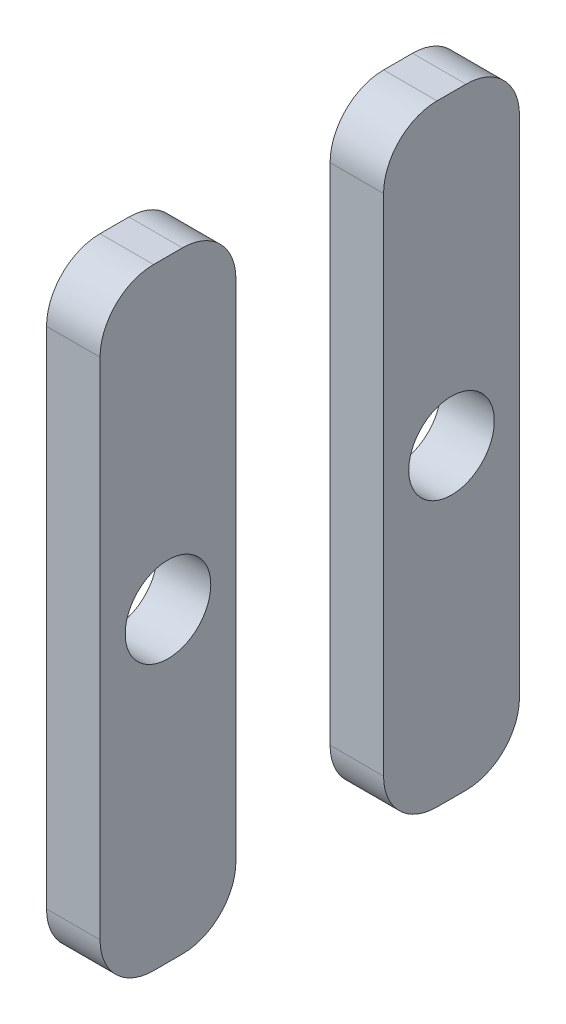
ISO-10303-21;
HEADER;
FILE_DESCRIPTION(('STEP AP214'),'2;1');
FILE_NAME('part.step','',(''),(''),'','','');
FILE_SCHEMA(('AUTOMOTIVE_DESIGN { 1 0 10303 214 1 1 1 1 }'));
ENDSEC;
DATA;
#1=APPLICATION_CONTEXT('core data for automotive mechanical design processes');
#2=APPLICATION_PROTOCOL_DEFINITION('international standard','automotive_design',2000,#1);
#3=PRODUCT_CONTEXT('',#1,'mechanical');
#4=PRODUCT('Part','Part','',(#3));
#5=PRODUCT_RELATED_PRODUCT_CATEGORY('part','',(#4));
#6=PRODUCT_DEFINITION_FORMATION('','',#4);
#7=PRODUCT_DEFINITION_CONTEXT('part definition',#1,'design');
#8=PRODUCT_DEFINITION('design','',#6,#7);
#9=PRODUCT_DEFINITION_SHAPE('','',#8);
#10=(LENGTH_UNIT() NAMED_UNIT(*) SI_UNIT(.MILLI.,.METRE.));
#11=(NAMED_UNIT(*) PLANE_ANGLE_UNIT() SI_UNIT($,.RADIAN.));
#12=(NAMED_UNIT(*) SI_UNIT($,.STERADIAN.) SOLID_ANGLE_UNIT());
#13=UNCERTAINTY_MEASURE_WITH_UNIT(LENGTH_MEASURE(1.E-05),#10,'distance_accuracy_value','');
#14=(GEOMETRIC_REPRESENTATION_CONTEXT(3) GLOBAL_UNCERTAINTY_ASSIGNED_CONTEXT((#13)) GLOBAL_UNIT_ASSIGNED_CONTEXT((#10,
#11,#12)) REPRESENTATION_CONTEXT('',''));
#15=CARTESIAN_POINT('',(0.,0.,0.));
#16=DIRECTION('',(0.,0.,1.));
#17=DIRECTION('',(1.,0.,0.));
#18=AXIS2_PLACEMENT_3D('',#15,#16,#17);
#19=CARTESIAN_POINT('',(10.,0.,0.));
#20=DIRECTION('',(-1.,0.,0.));
#21=DIRECTION('',(0.,0.,1.));
#22=AXIS2_PLACEMENT_3D('',#19,#20,#21);
#23=PLANE('',#22);
#24=DIRECTION('',(0.,-1.,0.));
#25=VECTOR('',#24,1.);
#26=CARTESIAN_POINT('',(10.,57.155,-13.8));
#27=LINE('',#26,#25);
#28=CARTESIAN_POINT('',(10.,47.155,-13.8));
#29=VERTEX_POINT('',#28);
#30=CARTESIAN_POINT('',(10.,-47.155,-13.8));
#31=VERTEX_POINT('',#30);
#32=EDGE_CURVE('E155',#29,#31,#27,.T.);
#33=ORIENTED_EDGE('',*,*,#32,.T.);
#34=CARTESIAN_POINT('',(10.,-47.155,-23.8));
#35=DIRECTION('',(-1.,0.,0.));
#36=DIRECTION('',(0.,0.,1.));
#37=AXIS2_PLACEMENT_3D('',#34,#35,#36);
#38=CIRCLE('',#37,10.);
#39=CARTESIAN_POINT('',(10.,-57.155,-23.8));
#40=VERTEX_POINT('',#39);
#41=EDGE_CURVE('E177',#31,#40,#38,.F.);
#42=ORIENTED_EDGE('',*,*,#41,.T.);
#43=DIRECTION('',(0.,0.,-1.));
#44=VECTOR('',#43,1.);
#45=CARTESIAN_POINT('',(10.,-57.155,-39.2));
#46=LINE('',#45,#44);
#47=CARTESIAN_POINT('',(10.,-57.155,-29.2));
#48=VERTEX_POINT('',#47);
#49=EDGE_CURVE('E134',#40,#48,#46,.T.);
#50=ORIENTED_EDGE('',*,*,#49,.T.);
#51=CARTESIAN_POINT('',(10.,-47.155,-29.2));
#52=DIRECTION('',(-1.,0.,0.));
#53=DIRECTION('',(0.,0.,1.));
#54=AXIS2_PLACEMENT_3D('',#51,#52,#53);
#55=CIRCLE('',#54,10.);
#56=CARTESIAN_POINT('',(10.,-47.155,-39.2));
#57=VERTEX_POINT('',#56);
#58=EDGE_CURVE('E175',#48,#57,#55,.F.);
#59=ORIENTED_EDGE('',*,*,#58,.T.);
#60=DIRECTION('',(0.,1.,0.));
#61=VECTOR('',#60,1.);
#62=CARTESIAN_POINT('',(10.,57.155,-39.2));
#63=LINE('',#62,#61);
#64=CARTESIAN_POINT('',(10.,47.155,-39.2));
#65=VERTEX_POINT('',#64);
#66=EDGE_CURVE('E142',#57,#65,#63,.T.);
#67=ORIENTED_EDGE('',*,*,#66,.T.);
#68=CARTESIAN_POINT('',(10.,47.155,-29.2));
#69=DIRECTION('',(-1.,0.,0.));
#70=DIRECTION('',(0.,0.,1.));
#71=AXIS2_PLACEMENT_3D('',#68,#69,#70);
#72=CIRCLE('',#71,10.);
#73=CARTESIAN_POINT('',(10.,57.155,-29.2));
#74=VERTEX_POINT('',#73);
#75=EDGE_CURVE('E69',#65,#74,#72,.F.);
#76=ORIENTED_EDGE('',*,*,#75,.T.);
#77=DIRECTION('',(0.,0.,1.));
#78=VECTOR('',#77,1.);
#79=CARTESIAN_POINT('',(10.,57.155,-39.2));
#80=LINE('',#79,#78);
#81=CARTESIAN_POINT('',(10.,57.155,-23.8));
#82=VERTEX_POINT('',#81);
#83=EDGE_CURVE('E146',#74,#82,#80,.T.);
#84=ORIENTED_EDGE('',*,*,#83,.T.);
#85=CARTESIAN_POINT('',(10.,47.155,-23.8));
#86=DIRECTION('',(-1.,0.,0.));
#87=DIRECTION('',(0.,0.,1.));
#88=AXIS2_PLACEMENT_3D('',#85,#86,#87);
#89=CIRCLE('',#88,10.);
#90=EDGE_CURVE('E173',#82,#29,#89,.F.);
#91=ORIENTED_EDGE('',*,*,#90,.T.);
#92=EDGE_LOOP('',(#33,#42,#50,#59,#67,#76,#84,#91));
#93=FACE_BOUND('',#92,.T.);
#94=CARTESIAN_POINT('',(10.,0.,-26.5));
#95=DIRECTION('',(1.,0.,0.));
#96=DIRECTION('',(0.,0.,1.));
#97=AXIS2_PLACEMENT_3D('',#94,#95,#96);
#98=CIRCLE('',#97,8.);
#99=CARTESIAN_POINT('',(10.,0.,-18.5));
#100=VERTEX_POINT('',#99);
#101=EDGE_CURVE('E153',#100,#100,#98,.T.);
#102=ORIENTED_EDGE('',*,*,#101,.F.);
#103=EDGE_LOOP('',(#102));
#104=FACE_BOUND('',#103,.T.);
#105=ADVANCED_FACE('F49',(#93,#104),#23,.F.);
#106=CARTESIAN_POINT('',(0.,0.,0.));
#107=DIRECTION('',(-1.,0.,0.));
#108=DIRECTION('',(0.,0.,1.));
#109=AXIS2_PLACEMENT_3D('',#106,#107,#108);
#110=PLANE('',#109);
#111=DIRECTION('',(0.,0.,-1.));
#112=VECTOR('',#111,1.);
#113=CARTESIAN_POINT('',(0.,-57.155,-39.2));
#114=LINE('',#113,#112);
#115=CARTESIAN_POINT('',(0.,-57.155,-23.8));
#116=VERTEX_POINT('',#115);
#117=CARTESIAN_POINT('',(0.,-57.155,-29.2));
#118=VERTEX_POINT('',#117);
#119=EDGE_CURVE('E131',#116,#118,#114,.T.);
#120=ORIENTED_EDGE('',*,*,#119,.F.);
#121=CARTESIAN_POINT('',(0.,-47.155,-23.8));
#122=DIRECTION('',(-1.,0.,0.));
#123=DIRECTION('',(0.,0.,1.));
#124=AXIS2_PLACEMENT_3D('',#121,#122,#123);
#125=CIRCLE('',#124,10.);
#126=CARTESIAN_POINT('',(0.,-47.155,-13.8));
#127=VERTEX_POINT('',#126);
#128=EDGE_CURVE('E114',#116,#127,#125,.T.);
#129=ORIENTED_EDGE('',*,*,#128,.T.);
#130=DIRECTION('',(0.,-1.,0.));
#131=VECTOR('',#130,1.);
#132=CARTESIAN_POINT('',(0.,57.155,-13.8));
#133=LINE('',#132,#131);
#134=CARTESIAN_POINT('',(0.,47.155,-13.8));
#135=VERTEX_POINT('',#134);
#136=EDGE_CURVE('E141',#135,#127,#133,.T.);
#137=ORIENTED_EDGE('',*,*,#136,.F.);
#138=CARTESIAN_POINT('',(0.,47.155,-23.8));
#139=DIRECTION('',(-1.,0.,0.));
#140=DIRECTION('',(0.,0.,1.));
#141=AXIS2_PLACEMENT_3D('',#138,#139,#140);
#142=CIRCLE('',#141,10.);
#143=CARTESIAN_POINT('',(0.,57.155,-23.8));
#144=VERTEX_POINT('',#143);
#145=EDGE_CURVE('E166',#135,#144,#142,.T.);
#146=ORIENTED_EDGE('',*,*,#145,.T.);
#147=DIRECTION('',(0.,0.,1.));
#148=VECTOR('',#147,1.);
#149=CARTESIAN_POINT('',(0.,57.155,-39.2));
#150=LINE('',#149,#148);
#151=CARTESIAN_POINT('',(0.,57.155,-29.2));
#152=VERTEX_POINT('',#151);
#153=EDGE_CURVE('E144',#152,#144,#150,.T.);
#154=ORIENTED_EDGE('',*,*,#153,.F.);
#155=CARTESIAN_POINT('',(0.,47.155,-29.2));
#156=DIRECTION('',(-1.,0.,0.));
#157=DIRECTION('',(0.,0.,1.));
#158=AXIS2_PLACEMENT_3D('',#155,#156,#157);
#159=CIRCLE('',#158,10.);
#160=CARTESIAN_POINT('',(0.,47.155,-39.2));
#161=VERTEX_POINT('',#160);
#162=EDGE_CURVE('E135',#152,#161,#159,.T.);
#163=ORIENTED_EDGE('',*,*,#162,.T.);
#164=DIRECTION('',(0.,1.,0.));
#165=VECTOR('',#164,1.);
#166=CARTESIAN_POINT('',(0.,57.155,-39.2));
#167=LINE('',#166,#165);
#168=CARTESIAN_POINT('',(0.,-47.155,-39.2));
#169=VERTEX_POINT('',#168);
#170=EDGE_CURVE('E150',#169,#161,#167,.T.);
#171=ORIENTED_EDGE('',*,*,#170,.F.);
#172=CARTESIAN_POINT('',(0.,-47.155,-29.2));
#173=DIRECTION('',(-1.,0.,0.));
#174=DIRECTION('',(0.,0.,1.));
#175=AXIS2_PLACEMENT_3D('',#172,#173,#174);
#176=CIRCLE('',#175,10.);
#177=EDGE_CURVE('E125',#169,#118,#176,.T.);
#178=ORIENTED_EDGE('',*,*,#177,.T.);
#179=EDGE_LOOP('',(#120,#129,#137,#146,#154,#163,#171,#178));
#180=FACE_BOUND('',#179,.T.);
#181=CARTESIAN_POINT('',(0.,0.,-26.5));
#182=DIRECTION('',(1.,0.,0.));
#183=DIRECTION('',(0.,0.,1.));
#184=AXIS2_PLACEMENT_3D('',#181,#182,#183);
#185=CIRCLE('',#184,8.);
#186=CARTESIAN_POINT('',(0.,0.,-18.5));
#187=VERTEX_POINT('',#186);
#188=EDGE_CURVE('E159',#187,#187,#185,.T.);
#189=ORIENTED_EDGE('',*,*,#188,.T.);
#190=EDGE_LOOP('',(#189));
#191=FACE_BOUND('',#190,.T.);
#192=ADVANCED_FACE('F138',(#180,#191),#110,.T.);
#193=CARTESIAN_POINT('',(10.,57.155,-39.2));
#194=DIRECTION('',(0.,0.,1.));
#195=DIRECTION('',(1.,0.,0.));
#196=AXIS2_PLACEMENT_3D('',#193,#194,#195);
#197=PLANE('',#196);
#198=ORIENTED_EDGE('',*,*,#66,.F.);
#199=DIRECTION('',(-1.,0.,0.));
#200=VECTOR('',#199,1.);
#201=CARTESIAN_POINT('',(10.,-47.155,-39.2));
#202=LINE('',#201,#200);
#203=EDGE_CURVE('E181',#57,#169,#202,.T.);
#204=ORIENTED_EDGE('',*,*,#203,.T.);
#205=ORIENTED_EDGE('',*,*,#170,.T.);
#206=DIRECTION('',(-1.,0.,0.));
#207=VECTOR('',#206,1.);
#208=CARTESIAN_POINT('',(10.,47.155,-39.2));
#209=LINE('',#208,#207);
#210=EDGE_CURVE('E179',#161,#65,#209,.F.);
#211=ORIENTED_EDGE('',*,*,#210,.T.);
#212=EDGE_LOOP('',(#198,#204,#205,#211));
#213=FACE_BOUND('',#212,.T.);
#214=ADVANCED_FACE('F202',(#213),#197,.F.);
#215=CARTESIAN_POINT('',(10.,57.155,-39.2));
#216=DIRECTION('',(0.,-1.,0.));
#217=DIRECTION('',(0.,0.,-1.));
#218=AXIS2_PLACEMENT_3D('',#215,#216,#217);
#219=PLANE('',#218);
#220=ORIENTED_EDGE('',*,*,#153,.T.);
#221=DIRECTION('',(-1.,0.,0.));
#222=VECTOR('',#221,1.);
#223=CARTESIAN_POINT('',(10.,57.155,-23.8));
#224=LINE('',#223,#222);
#225=EDGE_CURVE('E12',#144,#82,#224,.F.);
#226=ORIENTED_EDGE('',*,*,#225,.T.);
#227=ORIENTED_EDGE('',*,*,#83,.F.);
#228=DIRECTION('',(-1.,0.,0.));
#229=VECTOR('',#228,1.);
#230=CARTESIAN_POINT('',(10.,57.155,-29.2));
#231=LINE('',#230,#229);
#232=EDGE_CURVE('E57',#74,#152,#231,.T.);
#233=ORIENTED_EDGE('',*,*,#232,.T.);
#234=EDGE_LOOP('',(#220,#226,#227,#233));
#235=FACE_BOUND('',#234,.T.);
#236=ADVANCED_FACE('F186',(#235),#219,.F.);
#237=CARTESIAN_POINT('',(10.,57.155,-13.8));
#238=DIRECTION('',(0.,0.,-1.));
#239=DIRECTION('',(0.,1.,0.));
#240=AXIS2_PLACEMENT_3D('',#237,#238,#239);
#241=PLANE('',#240);
#242=ORIENTED_EDGE('',*,*,#136,.T.);
#243=DIRECTION('',(-1.,0.,0.));
#244=VECTOR('',#243,1.);
#245=CARTESIAN_POINT('',(10.,-47.155,-13.8));
#246=LINE('',#245,#244);
#247=EDGE_CURVE('E119',#127,#31,#246,.F.);
#248=ORIENTED_EDGE('',*,*,#247,.T.);
#249=ORIENTED_EDGE('',*,*,#32,.F.);
#250=DIRECTION('',(-1.,0.,0.));
#251=VECTOR('',#250,1.);
#252=CARTESIAN_POINT('',(10.,47.155,-13.8));
#253=LINE('',#252,#251);
#254=EDGE_CURVE('E124',#29,#135,#253,.T.);
#255=ORIENTED_EDGE('',*,*,#254,.T.);
#256=EDGE_LOOP('',(#242,#248,#249,#255));
#257=FACE_BOUND('',#256,.T.);
#258=ADVANCED_FACE('F194',(#257),#241,.F.);
#259=CARTESIAN_POINT('',(10.,-57.155,-39.2));
#260=DIRECTION('',(0.,1.,0.));
#261=DIRECTION('',(0.,0.,1.));
#262=AXIS2_PLACEMENT_3D('',#259,#260,#261);
#263=PLANE('',#262);
#264=ORIENTED_EDGE('',*,*,#49,.F.);
#265=DIRECTION('',(-1.,0.,0.));
#266=VECTOR('',#265,1.);
#267=CARTESIAN_POINT('',(10.,-57.155,-23.8));
#268=LINE('',#267,#266);
#269=EDGE_CURVE('E118',#40,#116,#268,.T.);
#270=ORIENTED_EDGE('',*,*,#269,.T.);
#271=ORIENTED_EDGE('',*,*,#119,.T.);
#272=DIRECTION('',(-1.,0.,0.));
#273=VECTOR('',#272,1.);
#274=CARTESIAN_POINT('',(10.,-57.155,-29.2));
#275=LINE('',#274,#273);
#276=EDGE_CURVE('E136',#118,#48,#275,.F.);
#277=ORIENTED_EDGE('',*,*,#276,.T.);
#278=EDGE_LOOP('',(#264,#270,#271,#277));
#279=FACE_BOUND('',#278,.T.);
#280=ADVANCED_FACE('F130',(#279),#263,.F.);
#281=CARTESIAN_POINT('',(10.,0.,-26.5));
#282=DIRECTION('',(-1.,0.,0.));
#283=DIRECTION('',(0.,0.,1.));
#284=AXIS2_PLACEMENT_3D('',#281,#282,#283);
#285=CYLINDRICAL_SURFACE('',#284,8.);
#286=ORIENTED_EDGE('',*,*,#101,.T.);
#287=EDGE_LOOP('',(#286));
#288=FACE_BOUND('',#287,.T.);
#289=ORIENTED_EDGE('',*,*,#188,.F.);
#290=EDGE_LOOP('',(#289));
#291=FACE_BOUND('',#290,.T.);
#292=ADVANCED_FACE('F217',(#288,#291),#285,.F.);
#293=CARTESIAN_POINT('',(10.,-47.155,-23.8));
#294=DIRECTION('',(-1.,0.,0.));
#295=DIRECTION('',(0.,0.,1.));
#296=AXIS2_PLACEMENT_3D('',#293,#294,#295);
#297=CYLINDRICAL_SURFACE('',#296,10.);
#298=ORIENTED_EDGE('',*,*,#41,.F.);
#299=ORIENTED_EDGE('',*,*,#247,.F.);
#300=ORIENTED_EDGE('',*,*,#128,.F.);
#301=ORIENTED_EDGE('',*,*,#269,.F.);
#302=EDGE_LOOP('',(#298,#299,#300,#301));
#303=FACE_BOUND('',#302,.T.);
#304=ADVANCED_FACE('F117',(#303),#297,.T.);
#305=CARTESIAN_POINT('',(10.,-47.155,-29.2));
#306=DIRECTION('',(-1.,0.,0.));
#307=DIRECTION('',(0.,0.,1.));
#308=AXIS2_PLACEMENT_3D('',#305,#306,#307);
#309=CYLINDRICAL_SURFACE('',#308,10.);
#310=ORIENTED_EDGE('',*,*,#58,.F.);
#311=ORIENTED_EDGE('',*,*,#276,.F.);
#312=ORIENTED_EDGE('',*,*,#177,.F.);
#313=ORIENTED_EDGE('',*,*,#203,.F.);
#314=EDGE_LOOP('',(#310,#311,#312,#313));
#315=FACE_BOUND('',#314,.T.);
#316=ADVANCED_FACE('F200',(#315),#309,.T.);
#317=CARTESIAN_POINT('',(10.,47.155,-23.8));
#318=DIRECTION('',(-1.,0.,0.));
#319=DIRECTION('',(0.,0.,1.));
#320=AXIS2_PLACEMENT_3D('',#317,#318,#319);
#321=CYLINDRICAL_SURFACE('',#320,10.);
#322=ORIENTED_EDGE('',*,*,#90,.F.);
#323=ORIENTED_EDGE('',*,*,#225,.F.);
#324=ORIENTED_EDGE('',*,*,#145,.F.);
#325=ORIENTED_EDGE('',*,*,#254,.F.);
#326=EDGE_LOOP('',(#322,#323,#324,#325));
#327=FACE_BOUND('',#326,.T.);
#328=ADVANCED_FACE('F191',(#327),#321,.T.);
#329=CARTESIAN_POINT('',(10.,47.155,-29.2));
#330=DIRECTION('',(-1.,0.,0.));
#331=DIRECTION('',(0.,0.,1.));
#332=AXIS2_PLACEMENT_3D('',#329,#330,#331);
#333=CYLINDRICAL_SURFACE('',#332,10.);
#334=ORIENTED_EDGE('',*,*,#75,.F.);
#335=ORIENTED_EDGE('',*,*,#210,.F.);
#336=ORIENTED_EDGE('',*,*,#162,.F.);
#337=ORIENTED_EDGE('',*,*,#232,.F.);
#338=EDGE_LOOP('',(#334,#335,#336,#337));
#339=FACE_BOUND('',#338,.T.);
#340=ADVANCED_FACE('F51',(#339),#333,.T.);
#341=CLOSED_SHELL('',(#105,#192,#214,#236,#258,#280,#292,#304,#316,#328,#340));
#342=MANIFOLD_SOLID_BREP('B2',#341);
#343=CARTESIAN_POINT('',(10.,0.,0.));
#344=DIRECTION('',(1.,0.,0.));
#345=DIRECTION('',(0.,0.,-1.));
#346=AXIS2_PLACEMENT_3D('',#343,#344,#345);
#347=PLANE('',#346);
#348=DIRECTION('',(0.,0.,-1.));
#349=VECTOR('',#348,1.);
#350=CARTESIAN_POINT('',(10.,-57.155,39.2));
#351=LINE('',#350,#349);
#352=CARTESIAN_POINT('',(10.,-57.155,29.2));
#353=VERTEX_POINT('',#352);
#354=CARTESIAN_POINT('',(10.,-57.155,23.8));
#355=VERTEX_POINT('',#354);
#356=EDGE_CURVE('E402',#353,#355,#351,.T.);
#357=ORIENTED_EDGE('',*,*,#356,.T.);
#358=CARTESIAN_POINT('',(10.,-47.155,23.8));
#359=DIRECTION('',(1.,0.,0.));
#360=DIRECTION('',(0.,0.,-1.));
#361=AXIS2_PLACEMENT_3D('',#358,#359,#360);
#362=CIRCLE('',#361,10.);
#363=CARTESIAN_POINT('',(10.,-47.155,13.8));
#364=VERTEX_POINT('',#363);
#365=EDGE_CURVE('E420',#355,#364,#362,.T.);
#366=ORIENTED_EDGE('',*,*,#365,.T.);
#367=DIRECTION('',(0.,1.,0.));
#368=VECTOR('',#367,1.);
#369=CARTESIAN_POINT('',(10.,57.155,13.8));
#370=LINE('',#369,#368);
#371=CARTESIAN_POINT('',(10.,47.155,13.8));
#372=VERTEX_POINT('',#371);
#373=EDGE_CURVE('E384',#364,#372,#370,.T.);
#374=ORIENTED_EDGE('',*,*,#373,.T.);
#375=CARTESIAN_POINT('',(10.,47.155,23.8));
#376=DIRECTION('',(1.,0.,0.));
#377=DIRECTION('',(0.,0.,-1.));
#378=AXIS2_PLACEMENT_3D('',#375,#376,#377);
#379=CIRCLE('',#378,10.);
#380=CARTESIAN_POINT('',(10.,57.155,23.8));
#381=VERTEX_POINT('',#380);
#382=EDGE_CURVE('E416',#372,#381,#379,.T.);
#383=ORIENTED_EDGE('',*,*,#382,.T.);
#384=DIRECTION('',(0.,0.,1.));
#385=VECTOR('',#384,1.);
#386=CARTESIAN_POINT('',(10.,57.155,39.2));
#387=LINE('',#386,#385);
#388=CARTESIAN_POINT('',(10.,57.155,29.2));
#389=VERTEX_POINT('',#388);
#390=EDGE_CURVE('E429',#381,#389,#387,.T.);
#391=ORIENTED_EDGE('',*,*,#390,.T.);
#392=CARTESIAN_POINT('',(10.,47.155,29.2));
#393=DIRECTION('',(1.,0.,0.));
#394=DIRECTION('',(0.,0.,-1.));
#395=AXIS2_PLACEMENT_3D('',#392,#393,#394);
#396=CIRCLE('',#395,10.);
#397=CARTESIAN_POINT('',(10.,47.155,39.2));
#398=VERTEX_POINT('',#397);
#399=EDGE_CURVE('E319',#389,#398,#396,.T.);
#400=ORIENTED_EDGE('',*,*,#399,.T.);
#401=DIRECTION('',(0.,-1.,0.));
#402=VECTOR('',#401,1.);
#403=CARTESIAN_POINT('',(10.,57.155,39.2));
#404=LINE('',#403,#402);
#405=CARTESIAN_POINT('',(10.,-47.155,39.2));
#406=VERTEX_POINT('',#405);
#407=EDGE_CURVE('E435',#398,#406,#404,.T.);
#408=ORIENTED_EDGE('',*,*,#407,.T.);
#409=CARTESIAN_POINT('',(10.,-47.155,29.2));
#410=DIRECTION('',(1.,0.,0.));
#411=DIRECTION('',(0.,0.,-1.));
#412=AXIS2_PLACEMENT_3D('',#409,#410,#411);
#413=CIRCLE('',#412,10.);
#414=EDGE_CURVE('E418',#406,#353,#413,.T.);
#415=ORIENTED_EDGE('',*,*,#414,.T.);
#416=EDGE_LOOP('',(#357,#366,#374,#383,#391,#400,#408,#415));
#417=FACE_BOUND('',#416,.T.);
#418=CARTESIAN_POINT('',(10.,0.,26.5));
#419=DIRECTION('',(1.,0.,0.));
#420=DIRECTION('',(0.,0.,-1.));
#421=AXIS2_PLACEMENT_3D('',#418,#419,#420);
#422=CIRCLE('',#421,8.);
#423=CARTESIAN_POINT('',(10.,0.,18.5));
#424=VERTEX_POINT('',#423);
#425=EDGE_CURVE('E393',#424,#424,#422,.T.);
#426=ORIENTED_EDGE('',*,*,#425,.F.);
#427=EDGE_LOOP('',(#426));
#428=FACE_BOUND('',#427,.T.);
#429=ADVANCED_FACE('F297',(#417,#428),#347,.T.);
#430=CARTESIAN_POINT('',(0.,0.,0.));
#431=DIRECTION('',(1.,0.,0.));
#432=DIRECTION('',(0.,0.,-1.));
#433=AXIS2_PLACEMENT_3D('',#430,#431,#432);
#434=PLANE('',#433);
#435=DIRECTION('',(0.,1.,0.));
#436=VECTOR('',#435,1.);
#437=CARTESIAN_POINT('',(0.,57.155,13.8));
#438=LINE('',#437,#436);
#439=CARTESIAN_POINT('',(0.,-47.155,13.8));
#440=VERTEX_POINT('',#439);
#441=CARTESIAN_POINT('',(0.,47.155,13.8));
#442=VERTEX_POINT('',#441);
#443=EDGE_CURVE('E381',#440,#442,#438,.T.);
#444=ORIENTED_EDGE('',*,*,#443,.F.);
#445=CARTESIAN_POINT('',(0.,-47.155,23.8));
#446=DIRECTION('',(1.,0.,0.));
#447=DIRECTION('',(0.,0.,-1.));
#448=AXIS2_PLACEMENT_3D('',#445,#446,#447);
#449=CIRCLE('',#448,10.);
#450=CARTESIAN_POINT('',(0.,-57.155,23.8));
#451=VERTEX_POINT('',#450);
#452=EDGE_CURVE('E364',#440,#451,#449,.F.);
#453=ORIENTED_EDGE('',*,*,#452,.T.);
#454=DIRECTION('',(0.,0.,-1.));
#455=VECTOR('',#454,1.);
#456=CARTESIAN_POINT('',(0.,-57.155,39.2));
#457=LINE('',#456,#455);
#458=CARTESIAN_POINT('',(0.,-57.155,29.2));
#459=VERTEX_POINT('',#458);
#460=EDGE_CURVE('E406',#459,#451,#457,.T.);
#461=ORIENTED_EDGE('',*,*,#460,.F.);
#462=CARTESIAN_POINT('',(0.,-47.155,29.2));
#463=DIRECTION('',(1.,0.,0.));
#464=DIRECTION('',(0.,0.,-1.));
#465=AXIS2_PLACEMENT_3D('',#462,#463,#464);
#466=CIRCLE('',#465,10.);
#467=CARTESIAN_POINT('',(0.,-47.155,39.2));
#468=VERTEX_POINT('',#467);
#469=EDGE_CURVE('E375',#459,#468,#466,.F.);
#470=ORIENTED_EDGE('',*,*,#469,.T.);
#471=DIRECTION('',(0.,-1.,0.));
#472=VECTOR('',#471,1.);
#473=CARTESIAN_POINT('',(0.,57.155,39.2));
#474=LINE('',#473,#472);
#475=CARTESIAN_POINT('',(0.,47.155,39.2));
#476=VERTEX_POINT('',#475);
#477=EDGE_CURVE('E396',#476,#468,#474,.T.);
#478=ORIENTED_EDGE('',*,*,#477,.F.);
#479=CARTESIAN_POINT('',(0.,47.155,29.2));
#480=DIRECTION('',(1.,0.,0.));
#481=DIRECTION('',(0.,0.,-1.));
#482=AXIS2_PLACEMENT_3D('',#479,#480,#481);
#483=CIRCLE('',#482,10.);
#484=CARTESIAN_POINT('',(0.,57.155,29.2));
#485=VERTEX_POINT('',#484);
#486=EDGE_CURVE('E385',#476,#485,#483,.F.);
#487=ORIENTED_EDGE('',*,*,#486,.T.);
#488=DIRECTION('',(0.,0.,1.));
#489=VECTOR('',#488,1.);
#490=CARTESIAN_POINT('',(0.,57.155,39.2));
#491=LINE('',#490,#489);
#492=CARTESIAN_POINT('',(0.,57.155,23.8));
#493=VERTEX_POINT('',#492);
#494=EDGE_CURVE('E392',#493,#485,#491,.T.);
#495=ORIENTED_EDGE('',*,*,#494,.F.);
#496=CARTESIAN_POINT('',(0.,47.155,23.8));
#497=DIRECTION('',(1.,0.,0.));
#498=DIRECTION('',(0.,0.,-1.));
#499=AXIS2_PLACEMENT_3D('',#496,#497,#498);
#500=CIRCLE('',#499,10.);
#501=EDGE_CURVE('E391',#493,#442,#500,.F.);
#502=ORIENTED_EDGE('',*,*,#501,.T.);
#503=EDGE_LOOP('',(#444,#453,#461,#470,#478,#487,#495,#502));
#504=FACE_BOUND('',#503,.T.);
#505=CARTESIAN_POINT('',(0.,0.,26.5));
#506=DIRECTION('',(1.,0.,0.));
#507=DIRECTION('',(0.,0.,-1.));
#508=AXIS2_PLACEMENT_3D('',#505,#506,#507);
#509=CIRCLE('',#508,8.);
#510=CARTESIAN_POINT('',(0.,0.,18.5));
#511=VERTEX_POINT('',#510);
#512=EDGE_CURVE('E399',#511,#511,#509,.T.);
#513=ORIENTED_EDGE('',*,*,#512,.T.);
#514=EDGE_LOOP('',(#513));
#515=FACE_BOUND('',#514,.T.);
#516=ADVANCED_FACE('F388',(#504,#515),#434,.F.);
#517=CARTESIAN_POINT('',(10.,57.155,13.8));
#518=DIRECTION('',(0.,0.,1.));
#519=DIRECTION('',(0.,-1.,0.));
#520=AXIS2_PLACEMENT_3D('',#517,#518,#519);
#521=PLANE('',#520);
#522=ORIENTED_EDGE('',*,*,#373,.F.);
#523=DIRECTION('',(-1.,0.,0.));
#524=VECTOR('',#523,1.);
#525=CARTESIAN_POINT('',(10.,-47.155,13.8));
#526=LINE('',#525,#524);
#527=EDGE_CURVE('E368',#364,#440,#526,.T.);
#528=ORIENTED_EDGE('',*,*,#527,.T.);
#529=ORIENTED_EDGE('',*,*,#443,.T.);
#530=DIRECTION('',(-1.,0.,0.));
#531=VECTOR('',#530,1.);
#532=CARTESIAN_POINT('',(10.,47.155,13.8));
#533=LINE('',#532,#531);
#534=EDGE_CURVE('E386',#442,#372,#533,.F.);
#535=ORIENTED_EDGE('',*,*,#534,.T.);
#536=EDGE_LOOP('',(#522,#528,#529,#535));
#537=FACE_BOUND('',#536,.T.);
#538=ADVANCED_FACE('F380',(#537),#521,.F.);
#539=CARTESIAN_POINT('',(10.,57.155,39.2));
#540=DIRECTION('',(0.,-1.,0.));
#541=DIRECTION('',(0.,0.,-1.));
#542=AXIS2_PLACEMENT_3D('',#539,#540,#541);
#543=PLANE('',#542);
#544=ORIENTED_EDGE('',*,*,#390,.F.);
#545=DIRECTION('',(-1.,0.,0.));
#546=VECTOR('',#545,1.);
#547=CARTESIAN_POINT('',(10.,57.155,23.8));
#548=LINE('',#547,#546);
#549=EDGE_CURVE('E47',#381,#493,#548,.T.);
#550=ORIENTED_EDGE('',*,*,#549,.T.);
#551=ORIENTED_EDGE('',*,*,#494,.T.);
#552=DIRECTION('',(-1.,0.,0.));
#553=VECTOR('',#552,1.);
#554=CARTESIAN_POINT('',(10.,57.155,29.2));
#555=LINE('',#554,#553);
#556=EDGE_CURVE('E305',#485,#389,#555,.F.);
#557=ORIENTED_EDGE('',*,*,#556,.T.);
#558=EDGE_LOOP('',(#544,#550,#551,#557));
#559=FACE_BOUND('',#558,.T.);
#560=ADVANCED_FACE('F428',(#559),#543,.F.);
#561=CARTESIAN_POINT('',(10.,57.155,39.2));
#562=DIRECTION('',(0.,0.,-1.));
#563=DIRECTION('',(-1.,0.,0.));
#564=AXIS2_PLACEMENT_3D('',#561,#562,#563);
#565=PLANE('',#564);
#566=ORIENTED_EDGE('',*,*,#477,.T.);
#567=DIRECTION('',(-1.,0.,0.));
#568=VECTOR('',#567,1.);
#569=CARTESIAN_POINT('',(10.,-47.155,39.2));
#570=LINE('',#569,#568);
#571=EDGE_CURVE('E312',#468,#406,#570,.F.);
#572=ORIENTED_EDGE('',*,*,#571,.T.);
#573=ORIENTED_EDGE('',*,*,#407,.F.);
#574=DIRECTION('',(-1.,0.,0.));
#575=VECTOR('',#574,1.);
#576=CARTESIAN_POINT('',(10.,47.155,39.2));
#577=LINE('',#576,#575);
#578=EDGE_CURVE('E422',#398,#476,#577,.T.);
#579=ORIENTED_EDGE('',*,*,#578,.T.);
#580=EDGE_LOOP('',(#566,#572,#573,#579));
#581=FACE_BOUND('',#580,.T.);
#582=ADVANCED_FACE('F439',(#581),#565,.F.);
#583=CARTESIAN_POINT('',(10.,-57.155,39.2));
#584=DIRECTION('',(0.,1.,0.));
#585=DIRECTION('',(0.,0.,1.));
#586=AXIS2_PLACEMENT_3D('',#583,#584,#585);
#587=PLANE('',#586);
#588=ORIENTED_EDGE('',*,*,#460,.T.);
#589=DIRECTION('',(-1.,0.,0.));
#590=VECTOR('',#589,1.);
#591=CARTESIAN_POINT('',(10.,-57.155,23.8));
#592=LINE('',#591,#590);
#593=EDGE_CURVE('E369',#451,#355,#592,.F.);
#594=ORIENTED_EDGE('',*,*,#593,.T.);
#595=ORIENTED_EDGE('',*,*,#356,.F.);
#596=DIRECTION('',(-1.,0.,0.));
#597=VECTOR('',#596,1.);
#598=CARTESIAN_POINT('',(10.,-57.155,29.2));
#599=LINE('',#598,#597);
#600=EDGE_CURVE('E374',#353,#459,#599,.T.);
#601=ORIENTED_EDGE('',*,*,#600,.T.);
#602=EDGE_LOOP('',(#588,#594,#595,#601));
#603=FACE_BOUND('',#602,.T.);
#604=ADVANCED_FACE('F446',(#603),#587,.F.);
#605=CARTESIAN_POINT('',(10.,0.,26.5));
#606=DIRECTION('',(-1.,0.,0.));
#607=DIRECTION('',(0.,0.,1.));
#608=AXIS2_PLACEMENT_3D('',#605,#606,#607);
#609=CYLINDRICAL_SURFACE('',#608,8.);
#610=ORIENTED_EDGE('',*,*,#425,.T.);
#611=EDGE_LOOP('',(#610));
#612=FACE_BOUND('',#611,.T.);
#613=ORIENTED_EDGE('',*,*,#512,.F.);
#614=EDGE_LOOP('',(#613));
#615=FACE_BOUND('',#614,.T.);
#616=ADVANCED_FACE('F452',(#612,#615),#609,.F.);
#617=CARTESIAN_POINT('',(10.,-47.155,23.8));
#618=DIRECTION('',(-1.,0.,0.));
#619=DIRECTION('',(0.,0.,1.));
#620=AXIS2_PLACEMENT_3D('',#617,#618,#619);
#621=CYLINDRICAL_SURFACE('',#620,10.);
#622=ORIENTED_EDGE('',*,*,#365,.F.);
#623=ORIENTED_EDGE('',*,*,#593,.F.);
#624=ORIENTED_EDGE('',*,*,#452,.F.);
#625=ORIENTED_EDGE('',*,*,#527,.F.);
#626=EDGE_LOOP('',(#622,#623,#624,#625));
#627=FACE_BOUND('',#626,.T.);
#628=ADVANCED_FACE('F367',(#627),#621,.T.);
#629=CARTESIAN_POINT('',(10.,-47.155,29.2));
#630=DIRECTION('',(-1.,0.,0.));
#631=DIRECTION('',(0.,0.,1.));
#632=AXIS2_PLACEMENT_3D('',#629,#630,#631);
#633=CYLINDRICAL_SURFACE('',#632,10.);
#634=ORIENTED_EDGE('',*,*,#414,.F.);
#635=ORIENTED_EDGE('',*,*,#571,.F.);
#636=ORIENTED_EDGE('',*,*,#469,.F.);
#637=ORIENTED_EDGE('',*,*,#600,.F.);
#638=EDGE_LOOP('',(#634,#635,#636,#637));
#639=FACE_BOUND('',#638,.T.);
#640=ADVANCED_FACE('F443',(#639),#633,.T.);
#641=CARTESIAN_POINT('',(10.,47.155,23.8));
#642=DIRECTION('',(-1.,0.,0.));
#643=DIRECTION('',(0.,0.,1.));
#644=AXIS2_PLACEMENT_3D('',#641,#642,#643);
#645=CYLINDRICAL_SURFACE('',#644,10.);
#646=ORIENTED_EDGE('',*,*,#382,.F.);
#647=ORIENTED_EDGE('',*,*,#534,.F.);
#648=ORIENTED_EDGE('',*,*,#501,.F.);
#649=ORIENTED_EDGE('',*,*,#549,.F.);
#650=EDGE_LOOP('',(#646,#647,#648,#649));
#651=FACE_BOUND('',#650,.T.);
#652=ADVANCED_FACE('F476',(#651),#645,.T.);
#653=CARTESIAN_POINT('',(10.,47.155,29.2));
#654=DIRECTION('',(-1.,0.,0.));
#655=DIRECTION('',(0.,0.,1.));
#656=AXIS2_PLACEMENT_3D('',#653,#654,#655);
#657=CYLINDRICAL_SURFACE('',#656,10.);
#658=ORIENTED_EDGE('',*,*,#399,.F.);
#659=ORIENTED_EDGE('',*,*,#556,.F.);
#660=ORIENTED_EDGE('',*,*,#486,.F.);
#661=ORIENTED_EDGE('',*,*,#578,.F.);
#662=EDGE_LOOP('',(#658,#659,#660,#661));
#663=FACE_BOUND('',#662,.T.);
#664=ADVANCED_FACE('F299',(#663),#657,.T.);
#665=CLOSED_SHELL('',(#429,#516,#538,#560,#582,#604,#616,#628,#640,#652,#664));
#666=MANIFOLD_SOLID_BREP('B6',#665);
#667=ADVANCED_BREP_SHAPE_REPRESENTATION('',(#18,#342,#666),#14);
#668=SHAPE_DEFINITION_REPRESENTATION(#9,#667);
ENDSEC;
END-ISO-10303-21;
